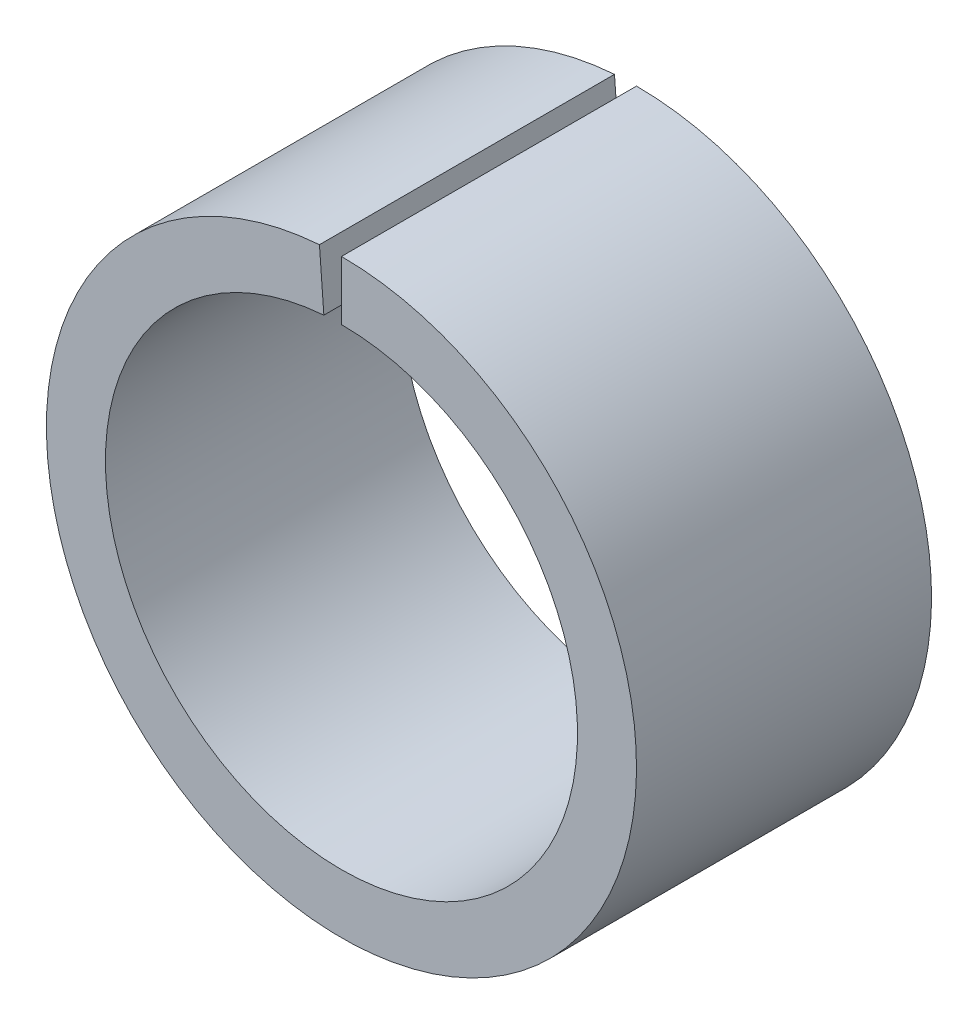
ISO-10303-21;
HEADER;
FILE_DESCRIPTION(('STEP AP214'),'2;1');
FILE_NAME('part.step','',(''),(''),'','','');
FILE_SCHEMA(('AUTOMOTIVE_DESIGN { 1 0 10303 214 1 1 1 1 }'));
ENDSEC;
DATA;
#1=APPLICATION_CONTEXT('core data for automotive mechanical design processes');
#2=APPLICATION_PROTOCOL_DEFINITION('international standard','automotive_design',2000,#1);
#3=PRODUCT_CONTEXT('',#1,'mechanical');
#4=PRODUCT('Part','Part','',(#3));
#5=PRODUCT_RELATED_PRODUCT_CATEGORY('part','',(#4));
#6=PRODUCT_DEFINITION_FORMATION('','',#4);
#7=PRODUCT_DEFINITION_CONTEXT('part definition',#1,'design');
#8=PRODUCT_DEFINITION('design','',#6,#7);
#9=PRODUCT_DEFINITION_SHAPE('','',#8);
#10=(LENGTH_UNIT() NAMED_UNIT(*) SI_UNIT(.MILLI.,.METRE.));
#11=(NAMED_UNIT(*) PLANE_ANGLE_UNIT() SI_UNIT($,.RADIAN.));
#12=(NAMED_UNIT(*) SI_UNIT($,.STERADIAN.) SOLID_ANGLE_UNIT());
#13=UNCERTAINTY_MEASURE_WITH_UNIT(LENGTH_MEASURE(1.E-05),#10,'distance_accuracy_value','');
#14=(GEOMETRIC_REPRESENTATION_CONTEXT(3) GLOBAL_UNCERTAINTY_ASSIGNED_CONTEXT((#13)) GLOBAL_UNIT_ASSIGNED_CONTEXT((#10,
#11,#12)) REPRESENTATION_CONTEXT('',''));
#15=CARTESIAN_POINT('',(0.,0.,0.));
#16=DIRECTION('',(0.,0.,1.));
#17=DIRECTION('',(1.,0.,0.));
#18=AXIS2_PLACEMENT_3D('',#15,#16,#17);
#19=CARTESIAN_POINT('',(0.,0.,5.));
#20=DIRECTION('',(0.,0.,1.));
#21=DIRECTION('',(1.,0.,0.));
#22=AXIS2_PLACEMENT_3D('',#19,#20,#21);
#23=PLANE('',#22);
#24=DIRECTION('',(0.0746206323219754,-0.997211994127562,0.));
#25=VECTOR('',#24,1.);
#26=CARTESIAN_POINT('',(-0.806504288675569,10.7779272964663,5.));
#27=LINE('',#26,#25);
#28=CARTESIAN_POINT('',(-0.373103161609877,4.98605997063781,5.));
#29=VERTEX_POINT('',#28);
#30=CARTESIAN_POINT('',(-0.298482529287902,3.98884797651025,5.));
#31=VERTEX_POINT('',#30);
#32=EDGE_CURVE('E62',#29,#31,#27,.T.);
#33=ORIENTED_EDGE('',*,*,#32,.F.);
#34=CARTESIAN_POINT('',(0.,0.,5.));
#35=DIRECTION('',(0.,0.,1.));
#36=DIRECTION('',(1.,0.,0.));
#37=AXIS2_PLACEMENT_3D('',#34,#35,#36);
#38=CIRCLE('',#37,5.);
#39=CARTESIAN_POINT('',(0.,5.,5.));
#40=VERTEX_POINT('',#39);
#41=EDGE_CURVE('E93',#29,#40,#38,.T.);
#42=ORIENTED_EDGE('',*,*,#41,.T.);
#43=DIRECTION('',(0.,1.,0.));
#44=VECTOR('',#43,1.);
#45=CARTESIAN_POINT('',(0.,0.,5.));
#46=LINE('',#45,#44);
#47=CARTESIAN_POINT('',(0.,4.,5.));
#48=VERTEX_POINT('',#47);
#49=EDGE_CURVE('E97',#48,#40,#46,.T.);
#50=ORIENTED_EDGE('',*,*,#49,.F.);
#51=CARTESIAN_POINT('',(0.,0.,5.));
#52=DIRECTION('',(0.,0.,1.));
#53=DIRECTION('',(1.,0.,0.));
#54=AXIS2_PLACEMENT_3D('',#51,#52,#53);
#55=CIRCLE('',#54,4.);
#56=EDGE_CURVE('E95',#31,#48,#55,.T.);
#57=ORIENTED_EDGE('',*,*,#56,.F.);
#58=EDGE_LOOP('',(#33,#42,#50,#57));
#59=FACE_BOUND('',#58,.T.);
#60=ADVANCED_FACE('F39',(#59),#23,.T.);
#61=CARTESIAN_POINT('',(0.,0.,0.));
#62=DIRECTION('',(0.,0.,1.));
#63=DIRECTION('',(1.,0.,0.));
#64=AXIS2_PLACEMENT_3D('',#61,#62,#63);
#65=PLANE('',#64);
#66=CARTESIAN_POINT('',(0.,0.,0.));
#67=DIRECTION('',(0.,0.,1.));
#68=DIRECTION('',(1.,0.,0.));
#69=AXIS2_PLACEMENT_3D('',#66,#67,#68);
#70=CIRCLE('',#69,5.);
#71=CARTESIAN_POINT('',(-0.373103161609877,4.98605997063781,0.));
#72=VERTEX_POINT('',#71);
#73=CARTESIAN_POINT('',(0.,5.,0.));
#74=VERTEX_POINT('',#73);
#75=EDGE_CURVE('E102',#72,#74,#70,.T.);
#76=ORIENTED_EDGE('',*,*,#75,.F.);
#77=DIRECTION('',(0.0746206323219754,-0.997211994127562,0.));
#78=VECTOR('',#77,1.);
#79=CARTESIAN_POINT('',(0.,0.,0.));
#80=LINE('',#79,#78);
#81=CARTESIAN_POINT('',(-0.298482529287902,3.98884797651025,0.));
#82=VERTEX_POINT('',#81);
#83=EDGE_CURVE('E81',#72,#82,#80,.T.);
#84=ORIENTED_EDGE('',*,*,#83,.T.);
#85=CARTESIAN_POINT('',(0.,0.,0.));
#86=DIRECTION('',(0.,0.,1.));
#87=DIRECTION('',(1.,0.,0.));
#88=AXIS2_PLACEMENT_3D('',#85,#86,#87);
#89=CIRCLE('',#88,4.);
#90=CARTESIAN_POINT('',(0.,4.,0.));
#91=VERTEX_POINT('',#90);
#92=EDGE_CURVE('E87',#82,#91,#89,.T.);
#93=ORIENTED_EDGE('',*,*,#92,.T.);
#94=DIRECTION('',(0.,1.,0.));
#95=VECTOR('',#94,1.);
#96=CARTESIAN_POINT('',(0.,0.,0.));
#97=LINE('',#96,#95);
#98=EDGE_CURVE('E55',#91,#74,#97,.T.);
#99=ORIENTED_EDGE('',*,*,#98,.T.);
#100=EDGE_LOOP('',(#76,#84,#93,#99));
#101=FACE_BOUND('',#100,.T.);
#102=ADVANCED_FACE('F125',(#101),#65,.F.);
#103=CARTESIAN_POINT('',(0.,0.,5.));
#104=DIRECTION('',(0.,0.,-1.));
#105=DIRECTION('',(-1.,0.,0.));
#106=AXIS2_PLACEMENT_3D('',#103,#104,#105);
#107=CYLINDRICAL_SURFACE('',#106,5.);
#108=ORIENTED_EDGE('',*,*,#41,.F.);
#109=DIRECTION('',(0.,0.,-1.));
#110=VECTOR('',#109,1.);
#111=CARTESIAN_POINT('',(-0.373103161609877,4.98605997063781,5.));
#112=LINE('',#111,#110);
#113=EDGE_CURVE('E78',#29,#72,#112,.T.);
#114=ORIENTED_EDGE('',*,*,#113,.T.);
#115=ORIENTED_EDGE('',*,*,#75,.T.);
#116=DIRECTION('',(0.,0.,-1.));
#117=VECTOR('',#116,1.);
#118=CARTESIAN_POINT('',(0.,5.,5.));
#119=LINE('',#118,#117);
#120=EDGE_CURVE('E100',#74,#40,#119,.F.);
#121=ORIENTED_EDGE('',*,*,#120,.T.);
#122=EDGE_LOOP('',(#108,#114,#115,#121));
#123=FACE_BOUND('',#122,.T.);
#124=ADVANCED_FACE('F41',(#123),#107,.T.);
#125=CARTESIAN_POINT('',(0.,0.,5.));
#126=DIRECTION('',(0.,0.,-1.));
#127=DIRECTION('',(-1.,0.,0.));
#128=AXIS2_PLACEMENT_3D('',#125,#126,#127);
#129=CYLINDRICAL_SURFACE('',#128,4.);
#130=DIRECTION('',(0.,0.,-1.));
#131=VECTOR('',#130,1.);
#132=CARTESIAN_POINT('',(-0.298482529287902,3.98884797651025,5.));
#133=LINE('',#132,#131);
#134=EDGE_CURVE('E11',#31,#82,#133,.T.);
#135=ORIENTED_EDGE('',*,*,#134,.F.);
#136=ORIENTED_EDGE('',*,*,#56,.T.);
#137=DIRECTION('',(0.,0.,-1.));
#138=VECTOR('',#137,1.);
#139=CARTESIAN_POINT('',(0.,4.,5.));
#140=LINE('',#139,#138);
#141=EDGE_CURVE('E48',#91,#48,#140,.F.);
#142=ORIENTED_EDGE('',*,*,#141,.F.);
#143=ORIENTED_EDGE('',*,*,#92,.F.);
#144=EDGE_LOOP('',(#135,#136,#142,#143));
#145=FACE_BOUND('',#144,.T.);
#146=ADVANCED_FACE('F122',(#145),#129,.F.);
#147=CARTESIAN_POINT('',(0.,0.,-5.));
#148=DIRECTION('',(1.,0.,0.));
#149=DIRECTION('',(0.,0.,-1.));
#150=AXIS2_PLACEMENT_3D('',#147,#148,#149);
#151=PLANE('',#150);
#152=ORIENTED_EDGE('',*,*,#98,.F.);
#153=ORIENTED_EDGE('',*,*,#141,.T.);
#154=ORIENTED_EDGE('',*,*,#49,.T.);
#155=ORIENTED_EDGE('',*,*,#120,.F.);
#156=EDGE_LOOP('',(#152,#153,#154,#155));
#157=FACE_BOUND('',#156,.T.);
#158=ADVANCED_FACE('F120',(#157),#151,.F.);
#159=CARTESIAN_POINT('',(-0.806504288675569,10.7779272964663,-5.));
#160=DIRECTION('',(-0.997211994127562,-0.0746206323219754,0.));
#161=DIRECTION('',(0.0746206323219754,-0.997211994127562,0.));
#162=AXIS2_PLACEMENT_3D('',#159,#160,#161);
#163=PLANE('',#162);
#164=ORIENTED_EDGE('',*,*,#32,.T.);
#165=ORIENTED_EDGE('',*,*,#134,.T.);
#166=ORIENTED_EDGE('',*,*,#83,.F.);
#167=ORIENTED_EDGE('',*,*,#113,.F.);
#168=EDGE_LOOP('',(#164,#165,#166,#167));
#169=FACE_BOUND('',#168,.T.);
#170=ADVANCED_FACE('F79',(#169),#163,.F.);
#171=CLOSED_SHELL('',(#60,#102,#124,#146,#158,#170));
#172=MANIFOLD_SOLID_BREP('B2',#171);
#173=ADVANCED_BREP_SHAPE_REPRESENTATION('',(#18,#172),#14);
#174=SHAPE_DEFINITION_REPRESENTATION(#9,#173);
ENDSEC;
END-ISO-10303-21;
